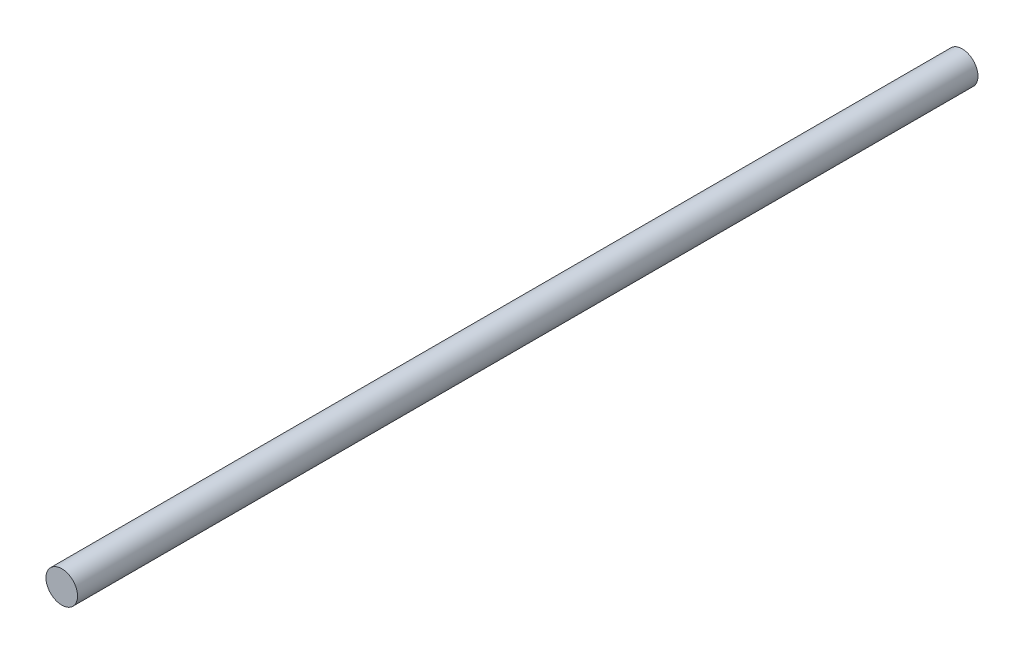
ISO-10303-21;
HEADER;
FILE_DESCRIPTION(('STEP AP214'),'2;1');
FILE_NAME('part.step','',(''),(''),'','','');
FILE_SCHEMA(('AUTOMOTIVE_DESIGN { 1 0 10303 214 1 1 1 1 }'));
ENDSEC;
DATA;
#1=APPLICATION_CONTEXT('core data for automotive mechanical design processes');
#2=APPLICATION_PROTOCOL_DEFINITION('international standard','automotive_design',2000,#1);
#3=PRODUCT_CONTEXT('',#1,'mechanical');
#4=PRODUCT('Part','Part','',(#3));
#5=PRODUCT_RELATED_PRODUCT_CATEGORY('part','',(#4));
#6=PRODUCT_DEFINITION_FORMATION('','',#4);
#7=PRODUCT_DEFINITION_CONTEXT('part definition',#1,'design');
#8=PRODUCT_DEFINITION('design','',#6,#7);
#9=PRODUCT_DEFINITION_SHAPE('','',#8);
#10=(LENGTH_UNIT() NAMED_UNIT(*) SI_UNIT(.MILLI.,.METRE.));
#11=(NAMED_UNIT(*) PLANE_ANGLE_UNIT() SI_UNIT($,.RADIAN.));
#12=(NAMED_UNIT(*) SI_UNIT($,.STERADIAN.) SOLID_ANGLE_UNIT());
#13=UNCERTAINTY_MEASURE_WITH_UNIT(LENGTH_MEASURE(1.E-05),#10,'distance_accuracy_value','');
#14=(GEOMETRIC_REPRESENTATION_CONTEXT(3) GLOBAL_UNCERTAINTY_ASSIGNED_CONTEXT((#13)) GLOBAL_UNIT_ASSIGNED_CONTEXT((#10,
#11,#12)) REPRESENTATION_CONTEXT('',''));
#15=CARTESIAN_POINT('',(0.,0.,0.));
#16=DIRECTION('',(0.,0.,1.));
#17=DIRECTION('',(1.,0.,0.));
#18=AXIS2_PLACEMENT_3D('',#15,#16,#17);
#19=CARTESIAN_POINT('',(0.,0.,570.));
#20=DIRECTION('',(0.,0.,-1.));
#21=DIRECTION('',(-1.,0.,0.));
#22=AXIS2_PLACEMENT_3D('',#19,#20,#21);
#23=CYLINDRICAL_SURFACE('',#22,10.);
#24=CARTESIAN_POINT('',(0.,0.,570.));
#25=DIRECTION('',(0.,0.,1.));
#26=DIRECTION('',(1.,0.,0.));
#27=AXIS2_PLACEMENT_3D('',#24,#25,#26);
#28=CIRCLE('',#27,10.);
#29=CARTESIAN_POINT('',(10.,0.,570.));
#30=VERTEX_POINT('',#29);
#31=EDGE_CURVE('E10',#30,#30,#28,.T.);
#32=ORIENTED_EDGE('',*,*,#31,.F.);
#33=EDGE_LOOP('',(#32));
#34=FACE_BOUND('',#33,.T.);
#35=CARTESIAN_POINT('',(0.,0.,0.));
#36=DIRECTION('',(0.,0.,1.));
#37=DIRECTION('',(1.,0.,0.));
#38=AXIS2_PLACEMENT_3D('',#35,#36,#37);
#39=CIRCLE('',#38,10.);
#40=CARTESIAN_POINT('',(10.,0.,0.));
#41=VERTEX_POINT('',#40);
#42=EDGE_CURVE('E34',#41,#41,#39,.T.);
#43=ORIENTED_EDGE('',*,*,#42,.T.);
#44=EDGE_LOOP('',(#43));
#45=FACE_BOUND('',#44,.T.);
#46=ADVANCED_FACE('F31',(#34,#45),#23,.T.);
#47=CARTESIAN_POINT('',(0.,0.,570.));
#48=DIRECTION('',(0.,0.,1.));
#49=DIRECTION('',(1.,0.,0.));
#50=AXIS2_PLACEMENT_3D('',#47,#48,#49);
#51=PLANE('',#50);
#52=ORIENTED_EDGE('',*,*,#31,.T.);
#53=EDGE_LOOP('',(#52));
#54=FACE_BOUND('',#53,.T.);
#55=ADVANCED_FACE('F46',(#54),#51,.T.);
#56=CARTESIAN_POINT('',(0.,0.,0.));
#57=DIRECTION('',(0.,0.,1.));
#58=DIRECTION('',(1.,0.,0.));
#59=AXIS2_PLACEMENT_3D('',#56,#57,#58);
#60=PLANE('',#59);
#61=ORIENTED_EDGE('',*,*,#42,.F.);
#62=EDGE_LOOP('',(#61));
#63=FACE_BOUND('',#62,.T.);
#64=ADVANCED_FACE('F44',(#63),#60,.F.);
#65=CLOSED_SHELL('',(#46,#55,#64));
#66=MANIFOLD_SOLID_BREP('B2',#65);
#67=ADVANCED_BREP_SHAPE_REPRESENTATION('',(#18,#66),#14);
#68=SHAPE_DEFINITION_REPRESENTATION(#9,#67);
ENDSEC;
END-ISO-10303-21;
